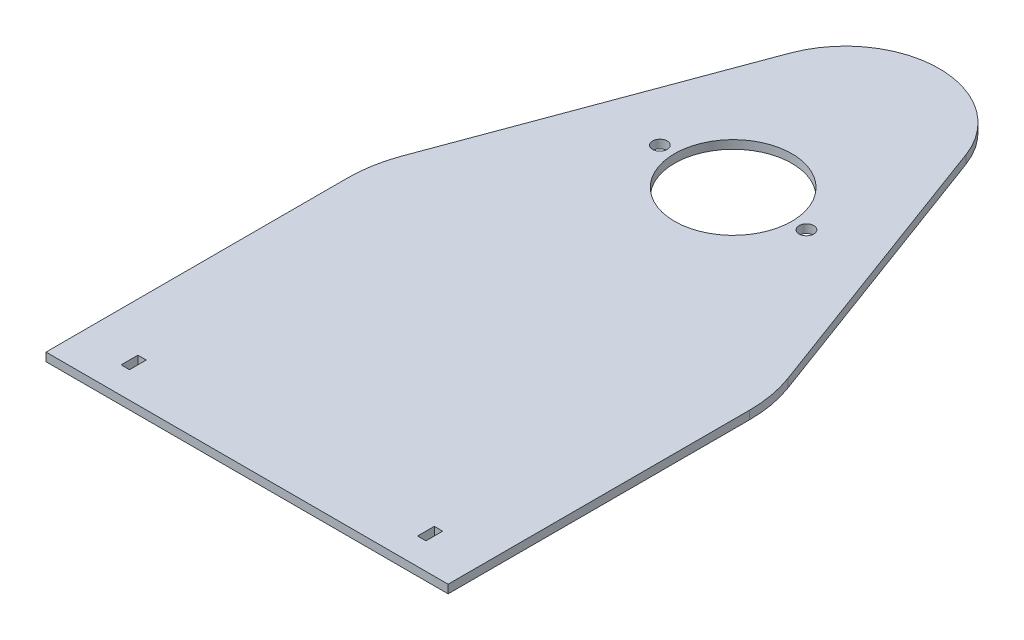
ISO-10303-21;
HEADER;
FILE_DESCRIPTION(('STEP AP214'),'2;1');
FILE_NAME('part.step','',(''),(''),'','','');
FILE_SCHEMA(('AUTOMOTIVE_DESIGN { 1 0 10303 214 1 1 1 1 }'));
ENDSEC;
DATA;
#1=APPLICATION_CONTEXT('core data for automotive mechanical design processes');
#2=APPLICATION_PROTOCOL_DEFINITION('international standard','automotive_design',2000,#1);
#3=PRODUCT_CONTEXT('',#1,'mechanical');
#4=PRODUCT('Part','Part','',(#3));
#5=PRODUCT_RELATED_PRODUCT_CATEGORY('part','',(#4));
#6=PRODUCT_DEFINITION_FORMATION('','',#4);
#7=PRODUCT_DEFINITION_CONTEXT('part definition',#1,'design');
#8=PRODUCT_DEFINITION('design','',#6,#7);
#9=PRODUCT_DEFINITION_SHAPE('','',#8);
#10=(LENGTH_UNIT() NAMED_UNIT(*) SI_UNIT(.MILLI.,.METRE.));
#11=(NAMED_UNIT(*) PLANE_ANGLE_UNIT() SI_UNIT($,.RADIAN.));
#12=(NAMED_UNIT(*) SI_UNIT($,.STERADIAN.) SOLID_ANGLE_UNIT());
#13=UNCERTAINTY_MEASURE_WITH_UNIT(LENGTH_MEASURE(1.E-05),#10,'distance_accuracy_value','');
#14=(GEOMETRIC_REPRESENTATION_CONTEXT(3) GLOBAL_UNCERTAINTY_ASSIGNED_CONTEXT((#13)) GLOBAL_UNIT_ASSIGNED_CONTEXT((#10,
#11,#12)) REPRESENTATION_CONTEXT('',''));
#15=CARTESIAN_POINT('',(0.,0.,0.));
#16=DIRECTION('',(0.,0.,1.));
#17=DIRECTION('',(1.,0.,0.));
#18=AXIS2_PLACEMENT_3D('',#15,#16,#17);
#19=CARTESIAN_POINT('',(50.8,3.175,-114.3));
#20=DIRECTION('',(0.,-1.,0.));
#21=DIRECTION('',(0.,0.,-1.));
#22=AXIS2_PLACEMENT_3D('',#19,#20,#21);
#23=PLANE('',#22);
#24=DIRECTION('',(0.,0.,1.));
#25=VECTOR('',#24,1.);
#26=CARTESIAN_POINT('',(18.4410604,3.175,-16.3877359656356));
#27=LINE('',#26,#25);
#28=CARTESIAN_POINT('',(18.4410604,3.175,-16.3877359656356));
#29=VERTEX_POINT('',#28);
#30=CARTESIAN_POINT('',(18.4410604,3.175,-10.0377359656356));
#31=VERTEX_POINT('',#30);
#32=EDGE_CURVE('E185',#29,#31,#27,.T.);
#33=ORIENTED_EDGE('',*,*,#32,.F.);
#34=DIRECTION('',(-1.,0.,0.));
#35=VECTOR('',#34,1.);
#36=CARTESIAN_POINT('',(18.4410604,3.175,-16.3877359656356));
#37=LINE('',#36,#35);
#38=CARTESIAN_POINT('',(21.6160604,3.175,-16.3877359656356));
#39=VERTEX_POINT('',#38);
#40=EDGE_CURVE('E193',#39,#29,#37,.T.);
#41=ORIENTED_EDGE('',*,*,#40,.F.);
#42=DIRECTION('',(0.,0.,-1.));
#43=VECTOR('',#42,1.);
#44=CARTESIAN_POINT('',(21.6160604,3.175,-16.3877359656356));
#45=LINE('',#44,#43);
#46=CARTESIAN_POINT('',(21.6160604,3.175,-10.0377359656356));
#47=VERTEX_POINT('',#46);
#48=EDGE_CURVE('E190',#47,#39,#45,.T.);
#49=ORIENTED_EDGE('',*,*,#48,.F.);
#50=DIRECTION('',(1.,0.,0.));
#51=VECTOR('',#50,1.);
#52=CARTESIAN_POINT('',(18.4410604,3.175,-10.0377359656356));
#53=LINE('',#52,#51);
#54=EDGE_CURVE('E187',#31,#47,#53,.T.);
#55=ORIENTED_EDGE('',*,*,#54,.F.);
#56=EDGE_LOOP('',(#33,#41,#49,#55));
#57=FACE_BOUND('',#56,.T.);
#58=DIRECTION('',(1.,0.,0.));
#59=VECTOR('',#58,1.);
#60=CARTESIAN_POINT('',(152.4,3.175,0.));
#61=LINE('',#60,#59);
#62=CARTESIAN_POINT('',(0.,3.175,0.));
#63=VERTEX_POINT('',#62);
#64=CARTESIAN_POINT('',(152.4,3.175,0.));
#65=VERTEX_POINT('',#64);
#66=EDGE_CURVE('E216',#63,#65,#61,.T.);
#67=ORIENTED_EDGE('',*,*,#66,.T.);
#68=DIRECTION('',(0.,0.,-1.));
#69=VECTOR('',#68,1.);
#70=CARTESIAN_POINT('',(152.4,3.175,-114.3));
#71=LINE('',#70,#69);
#72=CARTESIAN_POINT('',(152.4,3.175,-114.3));
#73=VERTEX_POINT('',#72);
#74=EDGE_CURVE('E219',#65,#73,#71,.T.);
#75=ORIENTED_EDGE('',*,*,#74,.T.);
#76=CARTESIAN_POINT('',(101.6,3.175,-114.3));
#77=DIRECTION('',(0.,1.,0.));
#78=DIRECTION('',(0.,0.,-1.));
#79=AXIS2_PLACEMENT_3D('',#76,#77,#78);
#80=CIRCLE('',#79,50.8);
#81=CARTESIAN_POINT('',(149.238694168906,3.175,-131.940714778076));
#82=VERTEX_POINT('',#81);
#83=EDGE_CURVE('E222',#73,#82,#80,.T.);
#84=ORIENTED_EDGE('',*,*,#83,.T.);
#85=DIRECTION('',(-0.347258164922763,0.,-0.937769570254055));
#86=VECTOR('',#85,1.);
#87=CARTESIAN_POINT('',(109.547085918234,3.175,-239.127776658115));
#88=LINE('',#87,#86);
#89=CARTESIAN_POINT('',(109.547085918234,3.175,-239.127776658115));
#90=VERTEX_POINT('',#89);
#91=EDGE_CURVE('E224',#82,#90,#88,.T.);
#92=ORIENTED_EDGE('',*,*,#91,.T.);
#93=CARTESIAN_POINT('',(76.2,3.175,-226.779276313461));
#94=DIRECTION('',(0.,1.,0.));
#95=DIRECTION('',(0.,0.,-1.));
#96=AXIS2_PLACEMENT_3D('',#93,#94,#95);
#97=CIRCLE('',#96,35.56);
#98=CARTESIAN_POINT('',(42.8529140817658,3.175,-239.127776658115));
#99=VERTEX_POINT('',#98);
#100=EDGE_CURVE('E226',#90,#99,#97,.T.);
#101=ORIENTED_EDGE('',*,*,#100,.T.);
#102=DIRECTION('',(-0.347258164922763,0.,0.937769570254055));
#103=VECTOR('',#102,1.);
#104=CARTESIAN_POINT('',(3.16130583109399,3.175,-131.940714778076));
#105=LINE('',#104,#103);
#106=CARTESIAN_POINT('',(3.16130583109401,3.175,-131.940714778076));
#107=VERTEX_POINT('',#106);
#108=EDGE_CURVE('E228',#99,#107,#105,.T.);
#109=ORIENTED_EDGE('',*,*,#108,.T.);
#110=CARTESIAN_POINT('',(50.8,3.175,-114.3));
#111=DIRECTION('',(0.,1.,0.));
#112=DIRECTION('',(0.,0.,-1.));
#113=AXIS2_PLACEMENT_3D('',#110,#111,#112);
#114=CIRCLE('',#113,50.8);
#115=CARTESIAN_POINT('',(0.,3.175,-114.3));
#116=VERTEX_POINT('',#115);
#117=EDGE_CURVE('E230',#107,#116,#114,.T.);
#118=ORIENTED_EDGE('',*,*,#117,.T.);
#119=DIRECTION('',(0.,0.,1.));
#120=VECTOR('',#119,1.);
#121=CARTESIAN_POINT('',(0.,3.175,0.));
#122=LINE('',#121,#120);
#123=EDGE_CURVE('E232',#116,#63,#122,.T.);
#124=ORIENTED_EDGE('',*,*,#123,.T.);
#125=EDGE_LOOP('',(#67,#75,#84,#92,#101,#109,#118,#124));
#126=FACE_BOUND('',#125,.T.);
#127=DIRECTION('',(0.,0.,-1.));
#128=VECTOR('',#127,1.);
#129=CARTESIAN_POINT('',(133.9589396,3.175,-16.3877359656356));
#130=LINE('',#129,#128);
#131=CARTESIAN_POINT('',(133.9589396,3.175,-10.0377359656356));
#132=VERTEX_POINT('',#131);
#133=CARTESIAN_POINT('',(133.9589396,3.175,-16.3877359656356));
#134=VERTEX_POINT('',#133);
#135=EDGE_CURVE('E146',#132,#134,#130,.T.);
#136=ORIENTED_EDGE('',*,*,#135,.F.);
#137=DIRECTION('',(1.,0.,0.));
#138=VECTOR('',#137,1.);
#139=CARTESIAN_POINT('',(133.9589396,3.175,-10.0377359656356));
#140=LINE('',#139,#138);
#141=CARTESIAN_POINT('',(130.7839396,3.175,-10.0377359656356));
#142=VERTEX_POINT('',#141);
#143=EDGE_CURVE('E169',#142,#132,#140,.T.);
#144=ORIENTED_EDGE('',*,*,#143,.F.);
#145=DIRECTION('',(0.,0.,1.));
#146=VECTOR('',#145,1.);
#147=CARTESIAN_POINT('',(130.7839396,3.175,-16.3877359656356));
#148=LINE('',#147,#146);
#149=CARTESIAN_POINT('',(130.7839396,3.175,-16.3877359656356));
#150=VERTEX_POINT('',#149);
#151=EDGE_CURVE('E167',#150,#142,#148,.T.);
#152=ORIENTED_EDGE('',*,*,#151,.F.);
#153=DIRECTION('',(-1.,0.,0.));
#154=VECTOR('',#153,1.);
#155=CARTESIAN_POINT('',(133.9589396,3.175,-16.3877359656356));
#156=LINE('',#155,#154);
#157=EDGE_CURVE('E154',#134,#150,#156,.T.);
#158=ORIENTED_EDGE('',*,*,#157,.F.);
#159=EDGE_LOOP('',(#136,#144,#152,#158));
#160=FACE_BOUND('',#159,.T.);
#161=CARTESIAN_POINT('',(76.2,3.175,-184.244137349727));
#162=DIRECTION('',(0.,1.,0.));
#163=DIRECTION('',(0.,0.,1.));
#164=AXIS2_PLACEMENT_3D('',#161,#162,#163);
#165=CIRCLE('',#164,22.225);
#166=CARTESIAN_POINT('',(76.2,3.175,-162.019137349727));
#167=VERTEX_POINT('',#166);
#168=EDGE_CURVE('E175',#167,#167,#165,.T.);
#169=ORIENTED_EDGE('',*,*,#168,.F.);
#170=EDGE_LOOP('',(#169));
#171=FACE_BOUND('',#170,.T.);
#172=CARTESIAN_POINT('',(103.98125,3.175,-184.244137349727));
#173=DIRECTION('',(0.,1.,0.));
#174=DIRECTION('',(0.,0.,1.));
#175=AXIS2_PLACEMENT_3D('',#172,#173,#174);
#176=CIRCLE('',#175,2.77812500000002);
#177=CARTESIAN_POINT('',(103.98125,3.175,-181.466012349727));
#178=VERTEX_POINT('',#177);
#179=EDGE_CURVE('E395',#178,#178,#176,.T.);
#180=ORIENTED_EDGE('',*,*,#179,.F.);
#181=EDGE_LOOP('',(#180));
#182=FACE_BOUND('',#181,.T.);
#183=CARTESIAN_POINT('',(48.4187500000001,3.175,-184.244137349727));
#184=DIRECTION('',(0.,1.,0.));
#185=DIRECTION('',(0.,0.,-1.));
#186=AXIS2_PLACEMENT_3D('',#183,#184,#185);
#187=CIRCLE('',#186,2.77812500000002);
#188=CARTESIAN_POINT('',(48.4187500000001,3.175,-187.022262349727));
#189=VERTEX_POINT('',#188);
#190=EDGE_CURVE('E386',#189,#189,#187,.T.);
#191=ORIENTED_EDGE('',*,*,#190,.F.);
#192=EDGE_LOOP('',(#191));
#193=FACE_BOUND('',#192,.T.);
#194=ADVANCED_FACE('F33',(#57,#126,#160,#171,#182,#193),#23,.F.);
#195=CARTESIAN_POINT('',(50.8,0.,-114.3));
#196=DIRECTION('',(0.,-1.,0.));
#197=DIRECTION('',(0.,0.,-1.));
#198=AXIS2_PLACEMENT_3D('',#195,#196,#197);
#199=PLANE('',#198);
#200=CARTESIAN_POINT('',(103.98125,0.,-184.244137349727));
#201=DIRECTION('',(0.,1.,0.));
#202=DIRECTION('',(0.,0.,1.));
#203=AXIS2_PLACEMENT_3D('',#200,#201,#202);
#204=CIRCLE('',#203,2.77812500000002);
#205=CARTESIAN_POINT('',(103.98125,0.,-181.466012349727));
#206=VERTEX_POINT('',#205);
#207=EDGE_CURVE('E392',#206,#206,#204,.T.);
#208=ORIENTED_EDGE('',*,*,#207,.T.);
#209=EDGE_LOOP('',(#208));
#210=FACE_BOUND('',#209,.T.);
#211=DIRECTION('',(1.,0.,0.));
#212=VECTOR('',#211,1.);
#213=CARTESIAN_POINT('',(133.9589396,0.,-10.0377359656356));
#214=LINE('',#213,#212);
#215=CARTESIAN_POINT('',(130.7839396,0.,-10.0377359656356));
#216=VERTEX_POINT('',#215);
#217=CARTESIAN_POINT('',(133.9589396,0.,-10.0377359656356));
#218=VERTEX_POINT('',#217);
#219=EDGE_CURVE('E155',#216,#218,#214,.T.);
#220=ORIENTED_EDGE('',*,*,#219,.T.);
#221=DIRECTION('',(0.,0.,-1.));
#222=VECTOR('',#221,1.);
#223=CARTESIAN_POINT('',(133.9589396,0.,-16.3877359656356));
#224=LINE('',#223,#222);
#225=CARTESIAN_POINT('',(133.9589396,0.,-16.3877359656356));
#226=VERTEX_POINT('',#225);
#227=EDGE_CURVE('E56',#218,#226,#224,.T.);
#228=ORIENTED_EDGE('',*,*,#227,.T.);
#229=DIRECTION('',(-1.,0.,0.));
#230=VECTOR('',#229,1.);
#231=CARTESIAN_POINT('',(133.9589396,0.,-16.3877359656356));
#232=LINE('',#231,#230);
#233=CARTESIAN_POINT('',(130.7839396,0.,-16.3877359656356));
#234=VERTEX_POINT('',#233);
#235=EDGE_CURVE('E161',#226,#234,#232,.T.);
#236=ORIENTED_EDGE('',*,*,#235,.T.);
#237=DIRECTION('',(0.,0.,1.));
#238=VECTOR('',#237,1.);
#239=CARTESIAN_POINT('',(130.7839396,0.,-16.3877359656356));
#240=LINE('',#239,#238);
#241=EDGE_CURVE('E177',#234,#216,#240,.T.);
#242=ORIENTED_EDGE('',*,*,#241,.T.);
#243=EDGE_LOOP('',(#220,#228,#236,#242));
#244=FACE_BOUND('',#243,.T.);
#245=DIRECTION('',(-1.,0.,0.));
#246=VECTOR('',#245,1.);
#247=CARTESIAN_POINT('',(18.4410604,0.,-16.3877359656356));
#248=LINE('',#247,#246);
#249=CARTESIAN_POINT('',(21.6160604,0.,-16.3877359656356));
#250=VERTEX_POINT('',#249);
#251=CARTESIAN_POINT('',(18.4410604,0.,-16.3877359656356));
#252=VERTEX_POINT('',#251);
#253=EDGE_CURVE('E188',#250,#252,#248,.T.);
#254=ORIENTED_EDGE('',*,*,#253,.T.);
#255=DIRECTION('',(0.,0.,1.));
#256=VECTOR('',#255,1.);
#257=CARTESIAN_POINT('',(18.4410604,0.,-16.3877359656356));
#258=LINE('',#257,#256);
#259=CARTESIAN_POINT('',(18.4410604,0.,-10.0377359656356));
#260=VERTEX_POINT('',#259);
#261=EDGE_CURVE('E162',#252,#260,#258,.T.);
#262=ORIENTED_EDGE('',*,*,#261,.T.);
#263=DIRECTION('',(1.,0.,0.));
#264=VECTOR('',#263,1.);
#265=CARTESIAN_POINT('',(18.4410604,0.,-10.0377359656356));
#266=LINE('',#265,#264);
#267=CARTESIAN_POINT('',(21.6160604,0.,-10.0377359656356));
#268=VERTEX_POINT('',#267);
#269=EDGE_CURVE('E198',#260,#268,#266,.T.);
#270=ORIENTED_EDGE('',*,*,#269,.T.);
#271=DIRECTION('',(0.,0.,-1.));
#272=VECTOR('',#271,1.);
#273=CARTESIAN_POINT('',(21.6160604,0.,-16.3877359656356));
#274=LINE('',#273,#272);
#275=EDGE_CURVE('E201',#268,#250,#274,.T.);
#276=ORIENTED_EDGE('',*,*,#275,.T.);
#277=EDGE_LOOP('',(#254,#262,#270,#276));
#278=FACE_BOUND('',#277,.T.);
#279=DIRECTION('',(1.,0.,0.));
#280=VECTOR('',#279,1.);
#281=CARTESIAN_POINT('',(152.4,0.,0.));
#282=LINE('',#281,#280);
#283=CARTESIAN_POINT('',(0.,0.,0.));
#284=VERTEX_POINT('',#283);
#285=CARTESIAN_POINT('',(152.4,0.,0.));
#286=VERTEX_POINT('',#285);
#287=EDGE_CURVE('E215',#284,#286,#282,.T.);
#288=ORIENTED_EDGE('',*,*,#287,.F.);
#289=DIRECTION('',(0.,0.,1.));
#290=VECTOR('',#289,1.);
#291=CARTESIAN_POINT('',(0.,0.,0.));
#292=LINE('',#291,#290);
#293=CARTESIAN_POINT('',(0.,0.,-114.3));
#294=VERTEX_POINT('',#293);
#295=EDGE_CURVE('E220',#294,#284,#292,.T.);
#296=ORIENTED_EDGE('',*,*,#295,.F.);
#297=CARTESIAN_POINT('',(50.8,0.,-114.3));
#298=DIRECTION('',(0.,1.,0.));
#299=DIRECTION('',(0.,0.,-1.));
#300=AXIS2_PLACEMENT_3D('',#297,#298,#299);
#301=CIRCLE('',#300,50.8);
#302=CARTESIAN_POINT('',(3.16130583109401,0.,-131.940714778076));
#303=VERTEX_POINT('',#302);
#304=EDGE_CURVE('E247',#303,#294,#301,.T.);
#305=ORIENTED_EDGE('',*,*,#304,.F.);
#306=DIRECTION('',(-0.347258164922763,0.,0.937769570254055));
#307=VECTOR('',#306,1.);
#308=CARTESIAN_POINT('',(3.16130583109399,0.,-131.940714778076));
#309=LINE('',#308,#307);
#310=CARTESIAN_POINT('',(42.8529140817658,0.,-239.127776658115));
#311=VERTEX_POINT('',#310);
#312=EDGE_CURVE('E245',#311,#303,#309,.T.);
#313=ORIENTED_EDGE('',*,*,#312,.F.);
#314=CARTESIAN_POINT('',(76.2,0.,-226.779276313461));
#315=DIRECTION('',(0.,1.,0.));
#316=DIRECTION('',(0.,0.,-1.));
#317=AXIS2_PLACEMENT_3D('',#314,#315,#316);
#318=CIRCLE('',#317,35.56);
#319=CARTESIAN_POINT('',(109.547085918234,0.,-239.127776658115));
#320=VERTEX_POINT('',#319);
#321=EDGE_CURVE('E243',#320,#311,#318,.T.);
#322=ORIENTED_EDGE('',*,*,#321,.F.);
#323=DIRECTION('',(-0.347258164922763,0.,-0.937769570254055));
#324=VECTOR('',#323,1.);
#325=CARTESIAN_POINT('',(109.547085918234,0.,-239.127776658115));
#326=LINE('',#325,#324);
#327=CARTESIAN_POINT('',(149.238694168906,0.,-131.940714778076));
#328=VERTEX_POINT('',#327);
#329=EDGE_CURVE('E241',#328,#320,#326,.T.);
#330=ORIENTED_EDGE('',*,*,#329,.F.);
#331=CARTESIAN_POINT('',(101.6,0.,-114.3));
#332=DIRECTION('',(0.,1.,0.));
#333=DIRECTION('',(0.,0.,-1.));
#334=AXIS2_PLACEMENT_3D('',#331,#332,#333);
#335=CIRCLE('',#334,50.8);
#336=CARTESIAN_POINT('',(152.4,0.,-114.3));
#337=VERTEX_POINT('',#336);
#338=EDGE_CURVE('E239',#337,#328,#335,.T.);
#339=ORIENTED_EDGE('',*,*,#338,.F.);
#340=DIRECTION('',(0.,0.,-1.));
#341=VECTOR('',#340,1.);
#342=CARTESIAN_POINT('',(152.4,0.,-114.3));
#343=LINE('',#342,#341);
#344=EDGE_CURVE('E237',#286,#337,#343,.T.);
#345=ORIENTED_EDGE('',*,*,#344,.F.);
#346=EDGE_LOOP('',(#288,#296,#305,#313,#322,#330,#339,#345));
#347=FACE_BOUND('',#346,.T.);
#348=CARTESIAN_POINT('',(76.2,0.,-184.244137349727));
#349=DIRECTION('',(0.,1.,0.));
#350=DIRECTION('',(0.,0.,1.));
#351=AXIS2_PLACEMENT_3D('',#348,#349,#350);
#352=CIRCLE('',#351,22.225);
#353=CARTESIAN_POINT('',(76.2,0.,-162.019137349727));
#354=VERTEX_POINT('',#353);
#355=EDGE_CURVE('E398',#354,#354,#352,.T.);
#356=ORIENTED_EDGE('',*,*,#355,.T.);
#357=EDGE_LOOP('',(#356));
#358=FACE_BOUND('',#357,.T.);
#359=CARTESIAN_POINT('',(48.4187500000001,0.,-184.244137349727));
#360=DIRECTION('',(0.,1.,0.));
#361=DIRECTION('',(0.,0.,-1.));
#362=AXIS2_PLACEMENT_3D('',#359,#360,#361);
#363=CIRCLE('',#362,2.77812500000002);
#364=CARTESIAN_POINT('',(48.4187500000001,0.,-187.022262349727));
#365=VERTEX_POINT('',#364);
#366=EDGE_CURVE('E389',#365,#365,#363,.T.);
#367=ORIENTED_EDGE('',*,*,#366,.T.);
#368=EDGE_LOOP('',(#367));
#369=FACE_BOUND('',#368,.T.);
#370=ADVANCED_FACE('F277',(#210,#244,#278,#347,#358,#369),#199,.T.);
#371=CARTESIAN_POINT('',(152.4,3.175,0.));
#372=DIRECTION('',(0.,0.,-1.));
#373=DIRECTION('',(-1.,0.,0.));
#374=AXIS2_PLACEMENT_3D('',#371,#372,#373);
#375=PLANE('',#374);
#376=ORIENTED_EDGE('',*,*,#287,.T.);
#377=DIRECTION('',(0.,-1.,0.));
#378=VECTOR('',#377,1.);
#379=CARTESIAN_POINT('',(152.4,3.175,0.));
#380=LINE('',#379,#378);
#381=EDGE_CURVE('E11',#65,#286,#380,.T.);
#382=ORIENTED_EDGE('',*,*,#381,.F.);
#383=ORIENTED_EDGE('',*,*,#66,.F.);
#384=DIRECTION('',(0.,-1.,0.));
#385=VECTOR('',#384,1.);
#386=CARTESIAN_POINT('',(0.,3.175,0.));
#387=LINE('',#386,#385);
#388=EDGE_CURVE('E234',#63,#284,#387,.T.);
#389=ORIENTED_EDGE('',*,*,#388,.T.);
#390=EDGE_LOOP('',(#376,#382,#383,#389));
#391=FACE_BOUND('',#390,.T.);
#392=ADVANCED_FACE('F35',(#391),#375,.F.);
#393=CARTESIAN_POINT('',(152.4,3.175,-114.3));
#394=DIRECTION('',(-1.,0.,0.));
#395=DIRECTION('',(0.,0.,1.));
#396=AXIS2_PLACEMENT_3D('',#393,#394,#395);
#397=PLANE('',#396);
#398=ORIENTED_EDGE('',*,*,#344,.T.);
#399=DIRECTION('',(0.,-1.,0.));
#400=VECTOR('',#399,1.);
#401=CARTESIAN_POINT('',(152.4,3.175,-114.3));
#402=LINE('',#401,#400);
#403=EDGE_CURVE('E41',#73,#337,#402,.T.);
#404=ORIENTED_EDGE('',*,*,#403,.F.);
#405=ORIENTED_EDGE('',*,*,#74,.F.);
#406=ORIENTED_EDGE('',*,*,#381,.T.);
#407=EDGE_LOOP('',(#398,#404,#405,#406));
#408=FACE_BOUND('',#407,.T.);
#409=ADVANCED_FACE('F294',(#408),#397,.F.);
#410=CARTESIAN_POINT('',(101.6,3.175,-114.3));
#411=DIRECTION('',(0.,-1.,0.));
#412=DIRECTION('',(0.,0.,-1.));
#413=AXIS2_PLACEMENT_3D('',#410,#411,#412);
#414=CYLINDRICAL_SURFACE('',#413,50.8);
#415=ORIENTED_EDGE('',*,*,#338,.T.);
#416=DIRECTION('',(0.,-1.,0.));
#417=VECTOR('',#416,1.);
#418=CARTESIAN_POINT('',(149.238694168906,3.175,-131.940714778076));
#419=LINE('',#418,#417);
#420=EDGE_CURVE('E264',#82,#328,#419,.T.);
#421=ORIENTED_EDGE('',*,*,#420,.F.);
#422=ORIENTED_EDGE('',*,*,#83,.F.);
#423=ORIENTED_EDGE('',*,*,#403,.T.);
#424=EDGE_LOOP('',(#415,#421,#422,#423));
#425=FACE_BOUND('',#424,.T.);
#426=ADVANCED_FACE('F271',(#425),#414,.T.);
#427=CARTESIAN_POINT('',(109.547085918234,3.175,-239.127776658115));
#428=DIRECTION('',(-0.937769570254055,0.,0.347258164922763));
#429=DIRECTION('',(0.347258164922763,0.,0.937769570254055));
#430=AXIS2_PLACEMENT_3D('',#427,#428,#429);
#431=PLANE('',#430);
#432=ORIENTED_EDGE('',*,*,#329,.T.);
#433=DIRECTION('',(0.,-1.,0.));
#434=VECTOR('',#433,1.);
#435=CARTESIAN_POINT('',(109.547085918234,3.175,-239.127776658115));
#436=LINE('',#435,#434);
#437=EDGE_CURVE('E261',#90,#320,#436,.T.);
#438=ORIENTED_EDGE('',*,*,#437,.F.);
#439=ORIENTED_EDGE('',*,*,#91,.F.);
#440=ORIENTED_EDGE('',*,*,#420,.T.);
#441=EDGE_LOOP('',(#432,#438,#439,#440));
#442=FACE_BOUND('',#441,.T.);
#443=ADVANCED_FACE('F283',(#442),#431,.F.);
#444=CARTESIAN_POINT('',(76.2,3.175,-226.779276313461));
#445=DIRECTION('',(0.,-1.,0.));
#446=DIRECTION('',(0.,0.,-1.));
#447=AXIS2_PLACEMENT_3D('',#444,#445,#446);
#448=CYLINDRICAL_SURFACE('',#447,35.56);
#449=ORIENTED_EDGE('',*,*,#321,.T.);
#450=DIRECTION('',(0.,-1.,0.));
#451=VECTOR('',#450,1.);
#452=CARTESIAN_POINT('',(42.8529140817658,3.175,-239.127776658115));
#453=LINE('',#452,#451);
#454=EDGE_CURVE('E258',#99,#311,#453,.T.);
#455=ORIENTED_EDGE('',*,*,#454,.F.);
#456=ORIENTED_EDGE('',*,*,#100,.F.);
#457=ORIENTED_EDGE('',*,*,#437,.T.);
#458=EDGE_LOOP('',(#449,#455,#456,#457));
#459=FACE_BOUND('',#458,.T.);
#460=ADVANCED_FACE('F287',(#459),#448,.T.);
#461=CARTESIAN_POINT('',(3.16130583109399,3.175,-131.940714778076));
#462=DIRECTION('',(0.937769570254055,0.,0.347258164922763));
#463=DIRECTION('',(0.347258164922763,0.,-0.937769570254055));
#464=AXIS2_PLACEMENT_3D('',#461,#462,#463);
#465=PLANE('',#464);
#466=ORIENTED_EDGE('',*,*,#312,.T.);
#467=DIRECTION('',(0.,-1.,0.));
#468=VECTOR('',#467,1.);
#469=CARTESIAN_POINT('',(3.16130583109401,3.175,-131.940714778076));
#470=LINE('',#469,#468);
#471=EDGE_CURVE('E255',#107,#303,#470,.T.);
#472=ORIENTED_EDGE('',*,*,#471,.F.);
#473=ORIENTED_EDGE('',*,*,#108,.F.);
#474=ORIENTED_EDGE('',*,*,#454,.T.);
#475=EDGE_LOOP('',(#466,#472,#473,#474));
#476=FACE_BOUND('',#475,.T.);
#477=ADVANCED_FACE('F307',(#476),#465,.F.);
#478=CARTESIAN_POINT('',(50.8,3.175,-114.3));
#479=DIRECTION('',(0.,-1.,0.));
#480=DIRECTION('',(0.,0.,-1.));
#481=AXIS2_PLACEMENT_3D('',#478,#479,#480);
#482=CYLINDRICAL_SURFACE('',#481,50.8);
#483=ORIENTED_EDGE('',*,*,#304,.T.);
#484=DIRECTION('',(0.,-1.,0.));
#485=VECTOR('',#484,1.);
#486=CARTESIAN_POINT('',(0.,3.175,-114.3));
#487=LINE('',#486,#485);
#488=EDGE_CURVE('E252',#116,#294,#487,.T.);
#489=ORIENTED_EDGE('',*,*,#488,.F.);
#490=ORIENTED_EDGE('',*,*,#117,.F.);
#491=ORIENTED_EDGE('',*,*,#471,.T.);
#492=EDGE_LOOP('',(#483,#489,#490,#491));
#493=FACE_BOUND('',#492,.T.);
#494=ADVANCED_FACE('F305',(#493),#482,.T.);
#495=CARTESIAN_POINT('',(0.,3.175,0.));
#496=DIRECTION('',(1.,0.,0.));
#497=DIRECTION('',(0.,0.,-1.));
#498=AXIS2_PLACEMENT_3D('',#495,#496,#497);
#499=PLANE('',#498);
#500=ORIENTED_EDGE('',*,*,#295,.T.);
#501=ORIENTED_EDGE('',*,*,#388,.F.);
#502=ORIENTED_EDGE('',*,*,#123,.F.);
#503=ORIENTED_EDGE('',*,*,#488,.T.);
#504=EDGE_LOOP('',(#500,#501,#502,#503));
#505=FACE_BOUND('',#504,.T.);
#506=ADVANCED_FACE('F300',(#505),#499,.F.);
#507=CARTESIAN_POINT('',(18.4410604,3.175,-16.3877359656356));
#508=DIRECTION('',(1.,0.,0.));
#509=DIRECTION('',(0.,0.,-1.));
#510=AXIS2_PLACEMENT_3D('',#507,#508,#509);
#511=PLANE('',#510);
#512=ORIENTED_EDGE('',*,*,#261,.F.);
#513=DIRECTION('',(0.,-1.,0.));
#514=VECTOR('',#513,1.);
#515=CARTESIAN_POINT('',(18.4410604,3.175,-16.3877359656356));
#516=LINE('',#515,#514);
#517=EDGE_CURVE('E195',#29,#252,#516,.T.);
#518=ORIENTED_EDGE('',*,*,#517,.F.);
#519=ORIENTED_EDGE('',*,*,#32,.T.);
#520=DIRECTION('',(0.,-1.,0.));
#521=VECTOR('',#520,1.);
#522=CARTESIAN_POINT('',(18.4410604,3.175,-10.0377359656356));
#523=LINE('',#522,#521);
#524=EDGE_CURVE('E212',#31,#260,#523,.T.);
#525=ORIENTED_EDGE('',*,*,#524,.T.);
#526=EDGE_LOOP('',(#512,#518,#519,#525));
#527=FACE_BOUND('',#526,.T.);
#528=ADVANCED_FACE('F326',(#527),#511,.T.);
#529=CARTESIAN_POINT('',(18.4410604,3.175,-10.0377359656356));
#530=DIRECTION('',(0.,0.,-1.));
#531=DIRECTION('',(-1.,0.,0.));
#532=AXIS2_PLACEMENT_3D('',#529,#530,#531);
#533=PLANE('',#532);
#534=ORIENTED_EDGE('',*,*,#269,.F.);
#535=ORIENTED_EDGE('',*,*,#524,.F.);
#536=ORIENTED_EDGE('',*,*,#54,.T.);
#537=DIRECTION('',(0.,-1.,0.));
#538=VECTOR('',#537,1.);
#539=CARTESIAN_POINT('',(21.6160604,3.175,-10.0377359656356));
#540=LINE('',#539,#538);
#541=EDGE_CURVE('E210',#47,#268,#540,.T.);
#542=ORIENTED_EDGE('',*,*,#541,.T.);
#543=EDGE_LOOP('',(#534,#535,#536,#542));
#544=FACE_BOUND('',#543,.T.);
#545=ADVANCED_FACE('F333',(#544),#533,.T.);
#546=CARTESIAN_POINT('',(21.6160604,3.175,-16.3877359656356));
#547=DIRECTION('',(-1.,0.,0.));
#548=DIRECTION('',(0.,0.,1.));
#549=AXIS2_PLACEMENT_3D('',#546,#547,#548);
#550=PLANE('',#549);
#551=ORIENTED_EDGE('',*,*,#275,.F.);
#552=ORIENTED_EDGE('',*,*,#541,.F.);
#553=ORIENTED_EDGE('',*,*,#48,.T.);
#554=DIRECTION('',(0.,-1.,0.));
#555=VECTOR('',#554,1.);
#556=CARTESIAN_POINT('',(21.6160604,3.175,-16.3877359656356));
#557=LINE('',#556,#555);
#558=EDGE_CURVE('E208',#39,#250,#557,.T.);
#559=ORIENTED_EDGE('',*,*,#558,.T.);
#560=EDGE_LOOP('',(#551,#552,#553,#559));
#561=FACE_BOUND('',#560,.T.);
#562=ADVANCED_FACE('F338',(#561),#550,.T.);
#563=CARTESIAN_POINT('',(18.4410604,3.175,-16.3877359656356));
#564=DIRECTION('',(0.,0.,1.));
#565=DIRECTION('',(1.,0.,0.));
#566=AXIS2_PLACEMENT_3D('',#563,#564,#565);
#567=PLANE('',#566);
#568=ORIENTED_EDGE('',*,*,#253,.F.);
#569=ORIENTED_EDGE('',*,*,#558,.F.);
#570=ORIENTED_EDGE('',*,*,#40,.T.);
#571=ORIENTED_EDGE('',*,*,#517,.T.);
#572=EDGE_LOOP('',(#568,#569,#570,#571));
#573=FACE_BOUND('',#572,.T.);
#574=ADVANCED_FACE('F345',(#573),#567,.T.);
#575=CARTESIAN_POINT('',(133.9589396,3.175,-16.3877359656356));
#576=DIRECTION('',(-1.,0.,0.));
#577=DIRECTION('',(0.,0.,1.));
#578=AXIS2_PLACEMENT_3D('',#575,#576,#577);
#579=PLANE('',#578);
#580=ORIENTED_EDGE('',*,*,#227,.F.);
#581=DIRECTION('',(0.,-1.,0.));
#582=VECTOR('',#581,1.);
#583=CARTESIAN_POINT('',(133.9589396,3.175,-10.0377359656356));
#584=LINE('',#583,#582);
#585=EDGE_CURVE('E150',#132,#218,#584,.T.);
#586=ORIENTED_EDGE('',*,*,#585,.F.);
#587=ORIENTED_EDGE('',*,*,#135,.T.);
#588=DIRECTION('',(0.,-1.,0.));
#589=VECTOR('',#588,1.);
#590=CARTESIAN_POINT('',(133.9589396,3.175,-16.3877359656356));
#591=LINE('',#590,#589);
#592=EDGE_CURVE('E149',#134,#226,#591,.T.);
#593=ORIENTED_EDGE('',*,*,#592,.T.);
#594=EDGE_LOOP('',(#580,#586,#587,#593));
#595=FACE_BOUND('',#594,.T.);
#596=ADVANCED_FACE('F148',(#595),#579,.T.);
#597=CARTESIAN_POINT('',(133.9589396,3.175,-16.3877359656356));
#598=DIRECTION('',(0.,0.,1.));
#599=DIRECTION('',(1.,0.,0.));
#600=AXIS2_PLACEMENT_3D('',#597,#598,#599);
#601=PLANE('',#600);
#602=ORIENTED_EDGE('',*,*,#235,.F.);
#603=ORIENTED_EDGE('',*,*,#592,.F.);
#604=ORIENTED_EDGE('',*,*,#157,.T.);
#605=DIRECTION('',(0.,-1.,0.));
#606=VECTOR('',#605,1.);
#607=CARTESIAN_POINT('',(130.7839396,3.175,-16.3877359656356));
#608=LINE('',#607,#606);
#609=EDGE_CURVE('E163',#150,#234,#608,.T.);
#610=ORIENTED_EDGE('',*,*,#609,.T.);
#611=EDGE_LOOP('',(#602,#603,#604,#610));
#612=FACE_BOUND('',#611,.T.);
#613=ADVANCED_FACE('F158',(#612),#601,.T.);
#614=CARTESIAN_POINT('',(130.7839396,3.175,-16.3877359656356));
#615=DIRECTION('',(1.,0.,0.));
#616=DIRECTION('',(0.,0.,-1.));
#617=AXIS2_PLACEMENT_3D('',#614,#615,#616);
#618=PLANE('',#617);
#619=ORIENTED_EDGE('',*,*,#241,.F.);
#620=ORIENTED_EDGE('',*,*,#609,.F.);
#621=ORIENTED_EDGE('',*,*,#151,.T.);
#622=DIRECTION('',(0.,-1.,0.));
#623=VECTOR('',#622,1.);
#624=CARTESIAN_POINT('',(130.7839396,3.175,-10.0377359656356));
#625=LINE('',#624,#623);
#626=EDGE_CURVE('E48',#142,#216,#625,.T.);
#627=ORIENTED_EDGE('',*,*,#626,.T.);
#628=EDGE_LOOP('',(#619,#620,#621,#627));
#629=FACE_BOUND('',#628,.T.);
#630=ADVANCED_FACE('F363',(#629),#618,.T.);
#631=CARTESIAN_POINT('',(133.9589396,3.175,-10.0377359656356));
#632=DIRECTION('',(0.,0.,-1.));
#633=DIRECTION('',(-1.,0.,0.));
#634=AXIS2_PLACEMENT_3D('',#631,#632,#633);
#635=PLANE('',#634);
#636=ORIENTED_EDGE('',*,*,#219,.F.);
#637=ORIENTED_EDGE('',*,*,#626,.F.);
#638=ORIENTED_EDGE('',*,*,#143,.T.);
#639=ORIENTED_EDGE('',*,*,#585,.T.);
#640=EDGE_LOOP('',(#636,#637,#638,#639));
#641=FACE_BOUND('',#640,.T.);
#642=ADVANCED_FACE('F366',(#641),#635,.T.);
#643=CARTESIAN_POINT('',(76.2,3.175,-184.244137349727));
#644=DIRECTION('',(0.,-1.,0.));
#645=DIRECTION('',(0.,0.,-1.));
#646=AXIS2_PLACEMENT_3D('',#643,#644,#645);
#647=CYLINDRICAL_SURFACE('',#646,22.225);
#648=ORIENTED_EDGE('',*,*,#168,.T.);
#649=EDGE_LOOP('',(#648));
#650=FACE_BOUND('',#649,.T.);
#651=ORIENTED_EDGE('',*,*,#355,.F.);
#652=EDGE_LOOP('',(#651));
#653=FACE_BOUND('',#652,.T.);
#654=ADVANCED_FACE('F370',(#650,#653),#647,.F.);
#655=CARTESIAN_POINT('',(103.98125,3.175,-184.244137349727));
#656=DIRECTION('',(0.,-1.,0.));
#657=DIRECTION('',(0.,0.,-1.));
#658=AXIS2_PLACEMENT_3D('',#655,#656,#657);
#659=CYLINDRICAL_SURFACE('',#658,2.77812500000002);
#660=ORIENTED_EDGE('',*,*,#179,.T.);
#661=EDGE_LOOP('',(#660));
#662=FACE_BOUND('',#661,.T.);
#663=ORIENTED_EDGE('',*,*,#207,.F.);
#664=EDGE_LOOP('',(#663));
#665=FACE_BOUND('',#664,.T.);
#666=ADVANCED_FACE('F373',(#662,#665),#659,.F.);
#667=CARTESIAN_POINT('',(48.4187500000001,3.175,-184.244137349727));
#668=DIRECTION('',(0.,-1.,0.));
#669=DIRECTION('',(0.,0.,-1.));
#670=AXIS2_PLACEMENT_3D('',#667,#668,#669);
#671=CYLINDRICAL_SURFACE('',#670,2.77812500000002);
#672=ORIENTED_EDGE('',*,*,#190,.T.);
#673=EDGE_LOOP('',(#672));
#674=FACE_BOUND('',#673,.T.);
#675=ORIENTED_EDGE('',*,*,#366,.F.);
#676=EDGE_LOOP('',(#675));
#677=FACE_BOUND('',#676,.T.);
#678=ADVANCED_FACE('F377',(#674,#677),#671,.F.);
#679=CLOSED_SHELL('',(#194,#370,#392,#409,#426,#443,#460,#477,#494,#506,#528,#545,#562,#574,
#596,#613,#630,#642,#654,#666,#678));
#680=MANIFOLD_SOLID_BREP('B2',#679);
#681=ADVANCED_BREP_SHAPE_REPRESENTATION('',(#18,#680),#14);
#682=SHAPE_DEFINITION_REPRESENTATION(#9,#681);
ENDSEC;
END-ISO-10303-21;
